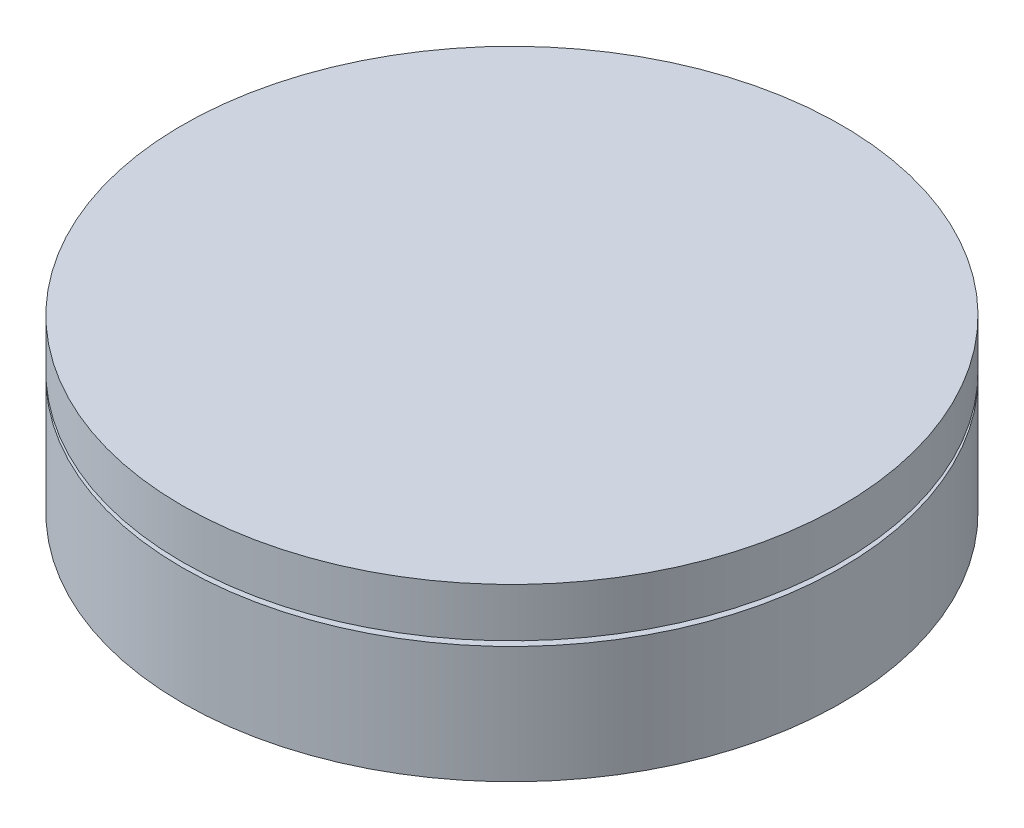
ISO-10303-21;
HEADER;
FILE_DESCRIPTION(('STEP AP214'),'2;1');
FILE_NAME('part.step','',(''),(''),'','','');
FILE_SCHEMA(('AUTOMOTIVE_DESIGN { 1 0 10303 214 1 1 1 1 }'));
ENDSEC;
DATA;
#1=APPLICATION_CONTEXT('core data for automotive mechanical design processes');
#2=APPLICATION_PROTOCOL_DEFINITION('international standard','automotive_design',2000,#1);
#3=PRODUCT_CONTEXT('',#1,'mechanical');
#4=PRODUCT('Part','Part','',(#3));
#5=PRODUCT_RELATED_PRODUCT_CATEGORY('part','',(#4));
#6=PRODUCT_DEFINITION_FORMATION('','',#4);
#7=PRODUCT_DEFINITION_CONTEXT('part definition',#1,'design');
#8=PRODUCT_DEFINITION('design','',#6,#7);
#9=PRODUCT_DEFINITION_SHAPE('','',#8);
#10=(LENGTH_UNIT() NAMED_UNIT(*) SI_UNIT(.MILLI.,.METRE.));
#11=(NAMED_UNIT(*) PLANE_ANGLE_UNIT() SI_UNIT($,.RADIAN.));
#12=(NAMED_UNIT(*) SI_UNIT($,.STERADIAN.) SOLID_ANGLE_UNIT());
#13=UNCERTAINTY_MEASURE_WITH_UNIT(LENGTH_MEASURE(1.E-05),#10,'distance_accuracy_value','');
#14=(GEOMETRIC_REPRESENTATION_CONTEXT(3) GLOBAL_UNCERTAINTY_ASSIGNED_CONTEXT((#13)) GLOBAL_UNIT_ASSIGNED_CONTEXT((#10,
#11,#12)) REPRESENTATION_CONTEXT('',''));
#15=CARTESIAN_POINT('',(0.,0.,0.));
#16=DIRECTION('',(0.,0.,1.));
#17=DIRECTION('',(1.,0.,0.));
#18=AXIS2_PLACEMENT_3D('',#15,#16,#17);
#19=CARTESIAN_POINT('',(0.,35.,0.));
#20=DIRECTION('',(0.,-1.,0.));
#21=DIRECTION('',(0.,0.,-1.));
#22=AXIS2_PLACEMENT_3D('',#19,#20,#21);
#23=CYLINDRICAL_SURFACE('',#22,67.5);
#24=CARTESIAN_POINT('',(0.,0.,0.));
#25=DIRECTION('',(0.,1.,0.));
#26=DIRECTION('',(0.,0.,1.));
#27=AXIS2_PLACEMENT_3D('',#24,#25,#26);
#28=CIRCLE('',#27,67.5);
#29=CARTESIAN_POINT('',(0.,0.,67.5));
#30=VERTEX_POINT('',#29);
#31=EDGE_CURVE('E34',#30,#30,#28,.T.);
#32=ORIENTED_EDGE('',*,*,#31,.T.);
#33=EDGE_LOOP('',(#32));
#34=FACE_BOUND('',#33,.T.);
#35=CARTESIAN_POINT('',(0.,24.,0.));
#36=DIRECTION('',(0.,1.,0.));
#37=DIRECTION('',(0.,0.,1.));
#38=AXIS2_PLACEMENT_3D('',#35,#36,#37);
#39=CIRCLE('',#38,67.5);
#40=CARTESIAN_POINT('',(0.,24.,67.5));
#41=VERTEX_POINT('',#40);
#42=EDGE_CURVE('E41',#41,#41,#39,.T.);
#43=ORIENTED_EDGE('',*,*,#42,.F.);
#44=EDGE_LOOP('',(#43));
#45=FACE_BOUND('',#44,.T.);
#46=ADVANCED_FACE('F30',(#34,#45),#23,.T.);
#47=CARTESIAN_POINT('',(0.,0.,0.));
#48=DIRECTION('',(0.,1.,0.));
#49=DIRECTION('',(0.,0.,1.));
#50=AXIS2_PLACEMENT_3D('',#47,#48,#49);
#51=PLANE('',#50);
#52=ORIENTED_EDGE('',*,*,#31,.F.);
#53=EDGE_LOOP('',(#52));
#54=FACE_BOUND('',#53,.T.);
#55=ADVANCED_FACE('F62',(#54),#51,.F.);
#56=CARTESIAN_POINT('',(0.,24.,0.));
#57=DIRECTION('',(0.,1.,0.));
#58=DIRECTION('',(0.,0.,1.));
#59=AXIS2_PLACEMENT_3D('',#56,#57,#58);
#60=PLANE('',#59);
#61=CARTESIAN_POINT('',(0.,24.,0.));
#62=DIRECTION('',(0.,1.,0.));
#63=DIRECTION('',(0.,0.,1.));
#64=AXIS2_PLACEMENT_3D('',#61,#62,#63);
#65=CIRCLE('',#64,47.5);
#66=CARTESIAN_POINT('',(0.,24.,47.5));
#67=VERTEX_POINT('',#66);
#68=EDGE_CURVE('E46',#67,#67,#65,.T.);
#69=ORIENTED_EDGE('',*,*,#68,.F.);
#70=EDGE_LOOP('',(#69));
#71=FACE_BOUND('',#70,.T.);
#72=ORIENTED_EDGE('',*,*,#42,.T.);
#73=EDGE_LOOP('',(#72));
#74=FACE_BOUND('',#73,.T.);
#75=ADVANCED_FACE('F58',(#71,#74),#60,.T.);
#76=CARTESIAN_POINT('',(0.,25.,0.));
#77=DIRECTION('',(0.,1.,0.));
#78=DIRECTION('',(0.,0.,1.));
#79=AXIS2_PLACEMENT_3D('',#76,#77,#78);
#80=PLANE('',#79);
#81=CARTESIAN_POINT('',(0.,25.,0.));
#82=DIRECTION('',(0.,1.,0.));
#83=DIRECTION('',(0.,0.,1.));
#84=AXIS2_PLACEMENT_3D('',#81,#82,#83);
#85=CIRCLE('',#84,47.5);
#86=CARTESIAN_POINT('',(0.,25.,47.5));
#87=VERTEX_POINT('',#86);
#88=EDGE_CURVE('E49',#87,#87,#85,.T.);
#89=ORIENTED_EDGE('',*,*,#88,.T.);
#90=EDGE_LOOP('',(#89));
#91=FACE_BOUND('',#90,.T.);
#92=CARTESIAN_POINT('',(0.,25.,0.));
#93=DIRECTION('',(0.,1.,0.));
#94=DIRECTION('',(0.,0.,1.));
#95=AXIS2_PLACEMENT_3D('',#92,#93,#94);
#96=CIRCLE('',#95,67.5);
#97=CARTESIAN_POINT('',(0.,25.,67.5));
#98=VERTEX_POINT('',#97);
#99=EDGE_CURVE('E43',#98,#98,#96,.T.);
#100=ORIENTED_EDGE('',*,*,#99,.F.);
#101=EDGE_LOOP('',(#100));
#102=FACE_BOUND('',#101,.T.);
#103=ADVANCED_FACE('F61',(#91,#102),#80,.F.);
#104=CARTESIAN_POINT('',(0.,24.,0.));
#105=DIRECTION('',(0.,1.,0.));
#106=DIRECTION('',(0.,0.,1.));
#107=AXIS2_PLACEMENT_3D('',#104,#105,#106);
#108=CYLINDRICAL_SURFACE('',#107,47.5);
#109=ORIENTED_EDGE('',*,*,#68,.T.);
#110=EDGE_LOOP('',(#109));
#111=FACE_BOUND('',#110,.T.);
#112=ORIENTED_EDGE('',*,*,#88,.F.);
#113=EDGE_LOOP('',(#112));
#114=FACE_BOUND('',#113,.T.);
#115=ADVANCED_FACE('F55',(#111,#114),#108,.T.);
#116=CARTESIAN_POINT('',(0.,35.,0.));
#117=DIRECTION('',(0.,1.,0.));
#118=DIRECTION('',(0.,0.,1.));
#119=AXIS2_PLACEMENT_3D('',#116,#117,#118);
#120=PLANE('',#119);
#121=CARTESIAN_POINT('',(0.,35.,0.));
#122=DIRECTION('',(0.,1.,0.));
#123=DIRECTION('',(0.,0.,1.));
#124=AXIS2_PLACEMENT_3D('',#121,#122,#123);
#125=CIRCLE('',#124,67.5);
#126=CARTESIAN_POINT('',(0.,35.,67.5));
#127=VERTEX_POINT('',#126);
#128=EDGE_CURVE('E10',#127,#127,#125,.T.);
#129=ORIENTED_EDGE('',*,*,#128,.T.);
#130=EDGE_LOOP('',(#129));
#131=FACE_BOUND('',#130,.T.);
#132=ADVANCED_FACE('F73',(#131),#120,.T.);
#133=ORIENTED_EDGE('',*,*,#99,.T.);
#134=EDGE_LOOP('',(#133));
#135=FACE_BOUND('',#134,.T.);
#136=ORIENTED_EDGE('',*,*,#128,.F.);
#137=EDGE_LOOP('',(#136));
#138=FACE_BOUND('',#137,.T.);
#139=ADVANCED_FACE('F32',(#135,#138),#23,.T.);
#140=CLOSED_SHELL('',(#46,#55,#75,#103,#115,#132,#139));
#141=MANIFOLD_SOLID_BREP('B2',#140);
#142=ADVANCED_BREP_SHAPE_REPRESENTATION('',(#18,#141),#14);
#143=SHAPE_DEFINITION_REPRESENTATION(#9,#142);
ENDSEC;
END-ISO-10303-21;
